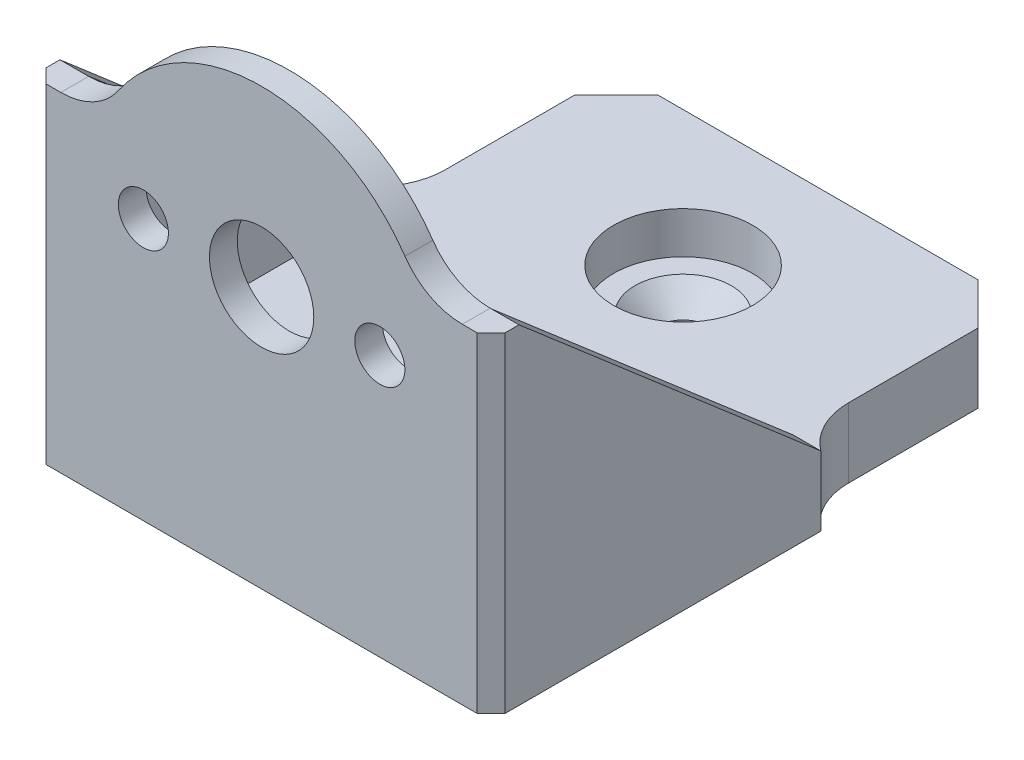
ISO-10303-21;
HEADER;
FILE_DESCRIPTION(('STEP AP214'),'2;1');
FILE_NAME('part.step','',(''),(''),'','','');
FILE_SCHEMA(('AUTOMOTIVE_DESIGN { 1 0 10303 214 1 1 1 1 }'));
ENDSEC;
DATA;
#1=APPLICATION_CONTEXT('core data for automotive mechanical design processes');
#2=APPLICATION_PROTOCOL_DEFINITION('international standard','automotive_design',2000,#1);
#3=PRODUCT_CONTEXT('',#1,'mechanical');
#4=PRODUCT('Part','Part','',(#3));
#5=PRODUCT_RELATED_PRODUCT_CATEGORY('part','',(#4));
#6=PRODUCT_DEFINITION_FORMATION('','',#4);
#7=PRODUCT_DEFINITION_CONTEXT('part definition',#1,'design');
#8=PRODUCT_DEFINITION('design','',#6,#7);
#9=PRODUCT_DEFINITION_SHAPE('','',#8);
#10=(LENGTH_UNIT() NAMED_UNIT(*) SI_UNIT(.MILLI.,.METRE.));
#11=(NAMED_UNIT(*) PLANE_ANGLE_UNIT() SI_UNIT($,.RADIAN.));
#12=(NAMED_UNIT(*) SI_UNIT($,.STERADIAN.) SOLID_ANGLE_UNIT());
#13=UNCERTAINTY_MEASURE_WITH_UNIT(LENGTH_MEASURE(1.E-05),#10,'distance_accuracy_value','');
#14=(GEOMETRIC_REPRESENTATION_CONTEXT(3) GLOBAL_UNCERTAINTY_ASSIGNED_CONTEXT((#13)) GLOBAL_UNIT_ASSIGNED_CONTEXT((#10,
#11,#12)) REPRESENTATION_CONTEXT('',''));
#15=CARTESIAN_POINT('',(0.,0.,0.));
#16=DIRECTION('',(0.,0.,1.));
#17=DIRECTION('',(1.,0.,0.));
#18=AXIS2_PLACEMENT_3D('',#15,#16,#17);
#19=CARTESIAN_POINT('',(0.,5.,0.));
#20=DIRECTION('',(0.,1.,0.));
#21=DIRECTION('',(0.,0.,1.));
#22=AXIS2_PLACEMENT_3D('',#19,#20,#21);
#23=PLANE('',#22);
#24=CARTESIAN_POINT('',(0.,5.,0.));
#25=DIRECTION('',(0.,1.,0.));
#26=DIRECTION('',(0.,0.,1.));
#27=AXIS2_PLACEMENT_3D('',#24,#25,#26);
#28=CIRCLE('',#27,5.);
#29=CARTESIAN_POINT('',(0.,5.,5.));
#30=VERTEX_POINT('',#29);
#31=EDGE_CURVE('E812',#30,#30,#28,.T.);
#32=ORIENTED_EDGE('',*,*,#31,.F.);
#33=EDGE_LOOP('',(#32));
#34=FACE_BOUND('',#33,.T.);
#35=CARTESIAN_POINT('',(0.,5.,20.));
#36=DIRECTION('',(0.,1.,0.));
#37=DIRECTION('',(0.,0.,1.));
#38=AXIS2_PLACEMENT_3D('',#35,#36,#37);
#39=CIRCLE('',#38,5.);
#40=CARTESIAN_POINT('',(0.,5.,25.));
#41=VERTEX_POINT('',#40);
#42=EDGE_CURVE('E809',#41,#41,#39,.T.);
#43=ORIENTED_EDGE('',*,*,#42,.F.);
#44=EDGE_LOOP('',(#43));
#45=FACE_BOUND('',#44,.T.);
#46=DIRECTION('',(0.,0.,-1.));
#47=VECTOR('',#46,1.);
#48=CARTESIAN_POINT('',(14.5,5.,-9.7));
#49=LINE('',#48,#47);
#50=CARTESIAN_POINT('',(14.5,5.,28.3));
#51=VERTEX_POINT('',#50);
#52=CARTESIAN_POINT('',(14.5,5.,6.60102051443365));
#53=VERTEX_POINT('',#52);
#54=EDGE_CURVE('E224',#51,#53,#49,.T.);
#55=ORIENTED_EDGE('',*,*,#54,.T.);
#56=DIRECTION('',(1.,0.,0.));
#57=VECTOR('',#56,1.);
#58=CARTESIAN_POINT('',(0.,5.,6.60102051443364));
#59=LINE('',#58,#57);
#60=CARTESIAN_POINT('',(16.5,5.,6.60102051443365));
#61=VERTEX_POINT('',#60);
#62=EDGE_CURVE('E11',#53,#61,#59,.T.);
#63=ORIENTED_EDGE('',*,*,#62,.T.);
#64=CARTESIAN_POINT('',(19.5,5.,2.60102051443364));
#65=DIRECTION('',(0.,1.,0.));
#66=DIRECTION('',(0.,0.,1.));
#67=AXIS2_PLACEMENT_3D('',#64,#65,#66);
#68=CIRCLE('',#67,5.);
#69=CARTESIAN_POINT('',(14.5,5.,2.60102051443364));
#70=VERTEX_POINT('',#69);
#71=EDGE_CURVE('E343',#61,#70,#68,.F.);
#72=ORIENTED_EDGE('',*,*,#71,.T.);
#73=CARTESIAN_POINT('',(14.5,5.,-6.69999999999997));
#74=VERTEX_POINT('',#73);
#75=EDGE_CURVE('E223',#70,#74,#49,.T.);
#76=ORIENTED_EDGE('',*,*,#75,.T.);
#77=DIRECTION('',(-0.707106781186546,0.,-0.707106781186549));
#78=VECTOR('',#77,1.);
#79=CARTESIAN_POINT('',(10.6,5.,-10.6));
#80=LINE('',#79,#78);
#81=CARTESIAN_POINT('',(11.5,5.,-9.7));
#82=VERTEX_POINT('',#81);
#83=EDGE_CURVE('E301',#74,#82,#80,.T.);
#84=ORIENTED_EDGE('',*,*,#83,.T.);
#85=DIRECTION('',(-1.,0.,0.));
#86=VECTOR('',#85,1.);
#87=CARTESIAN_POINT('',(-11.5,5.,-9.7));
#88=LINE('',#87,#86);
#89=CARTESIAN_POINT('',(-11.5,5.,-9.7));
#90=VERTEX_POINT('',#89);
#91=EDGE_CURVE('E268',#82,#90,#88,.T.);
#92=ORIENTED_EDGE('',*,*,#91,.T.);
#93=DIRECTION('',(-0.707106781186548,0.,0.707106781186547));
#94=VECTOR('',#93,1.);
#95=CARTESIAN_POINT('',(-10.6,5.,-10.6));
#96=LINE('',#95,#94);
#97=CARTESIAN_POINT('',(-14.5,5.,-6.7));
#98=VERTEX_POINT('',#97);
#99=EDGE_CURVE('E298',#90,#98,#96,.T.);
#100=ORIENTED_EDGE('',*,*,#99,.T.);
#101=DIRECTION('',(0.,0.,-1.));
#102=VECTOR('',#101,1.);
#103=CARTESIAN_POINT('',(-14.5,5.,28.3));
#104=LINE('',#103,#102);
#105=CARTESIAN_POINT('',(-14.5,5.,2.60102051443364));
#106=VERTEX_POINT('',#105);
#107=EDGE_CURVE('E241',#106,#98,#104,.T.);
#108=ORIENTED_EDGE('',*,*,#107,.F.);
#109=CARTESIAN_POINT('',(-19.5,5.,2.60102051443364));
#110=DIRECTION('',(0.,1.,0.));
#111=DIRECTION('',(0.,0.,1.));
#112=AXIS2_PLACEMENT_3D('',#109,#110,#111);
#113=CIRCLE('',#112,5.);
#114=CARTESIAN_POINT('',(-16.5,5.,6.60102051443364));
#115=VERTEX_POINT('',#114);
#116=EDGE_CURVE('E177',#106,#115,#113,.F.);
#117=ORIENTED_EDGE('',*,*,#116,.T.);
#118=DIRECTION('',(-1.,0.,0.));
#119=VECTOR('',#118,1.);
#120=CARTESIAN_POINT('',(-16.5,5.,6.60102051443364));
#121=LINE('',#120,#119);
#122=CARTESIAN_POINT('',(-14.5,5.,6.60102051443364));
#123=VERTEX_POINT('',#122);
#124=EDGE_CURVE('E44',#123,#115,#121,.T.);
#125=ORIENTED_EDGE('',*,*,#124,.F.);
#126=CARTESIAN_POINT('',(-14.5,5.,28.3));
#127=VERTEX_POINT('',#126);
#128=EDGE_CURVE('E242',#127,#123,#104,.T.);
#129=ORIENTED_EDGE('',*,*,#128,.F.);
#130=DIRECTION('',(-1.,0.,0.));
#131=VECTOR('',#130,1.);
#132=CARTESIAN_POINT('',(-11.5,5.,28.3));
#133=LINE('',#132,#131);
#134=EDGE_CURVE('E264',#51,#127,#133,.T.);
#135=ORIENTED_EDGE('',*,*,#134,.F.);
#136=EDGE_LOOP('',(#55,#63,#72,#76,#84,#92,#100,#108,#117,#125,#129,#135));
#137=FACE_BOUND('',#136,.T.);
#138=ADVANCED_FACE('F35',(#34,#45,#137),#23,.T.);
#139=CARTESIAN_POINT('',(0.,0.,0.));
#140=DIRECTION('',(0.,1.,0.));
#141=DIRECTION('',(0.,0.,1.));
#142=AXIS2_PLACEMENT_3D('',#139,#140,#141);
#143=PLANE('',#142);
#144=CARTESIAN_POINT('',(0.,0.,0.));
#145=DIRECTION('',(0.,1.,0.));
#146=DIRECTION('',(0.,0.,1.));
#147=AXIS2_PLACEMENT_3D('',#144,#145,#146);
#148=CIRCLE('',#147,1.8);
#149=CARTESIAN_POINT('',(0.,0.,1.8));
#150=VERTEX_POINT('',#149);
#151=EDGE_CURVE('E795',#150,#150,#148,.T.);
#152=ORIENTED_EDGE('',*,*,#151,.T.);
#153=EDGE_LOOP('',(#152));
#154=FACE_BOUND('',#153,.T.);
#155=CARTESIAN_POINT('',(0.,0.,20.));
#156=DIRECTION('',(0.,1.,0.));
#157=DIRECTION('',(0.,0.,1.));
#158=AXIS2_PLACEMENT_3D('',#155,#156,#157);
#159=CIRCLE('',#158,1.8);
#160=CARTESIAN_POINT('',(0.,0.,21.8));
#161=VERTEX_POINT('',#160);
#162=EDGE_CURVE('E806',#161,#161,#159,.T.);
#163=ORIENTED_EDGE('',*,*,#162,.T.);
#164=EDGE_LOOP('',(#163));
#165=FACE_BOUND('',#164,.T.);
#166=DIRECTION('',(0.,0.,-1.));
#167=VECTOR('',#166,1.);
#168=CARTESIAN_POINT('',(16.5,0.,30.3));
#169=LINE('',#168,#167);
#170=CARTESIAN_POINT('',(16.5,0.,29.3));
#171=VERTEX_POINT('',#170);
#172=CARTESIAN_POINT('',(16.5,0.,6.60102051443365));
#173=VERTEX_POINT('',#172);
#174=EDGE_CURVE('E207',#171,#173,#169,.T.);
#175=ORIENTED_EDGE('',*,*,#174,.F.);
#176=DIRECTION('',(-0.707106781186551,0.,0.707106781186544));
#177=VECTOR('',#176,1.);
#178=CARTESIAN_POINT('',(16.5,0.,29.3));
#179=LINE('',#178,#177);
#180=CARTESIAN_POINT('',(15.5,0.,30.3));
#181=VERTEX_POINT('',#180);
#182=EDGE_CURVE('E310',#171,#181,#179,.T.);
#183=ORIENTED_EDGE('',*,*,#182,.T.);
#184=DIRECTION('',(1.,0.,0.));
#185=VECTOR('',#184,1.);
#186=CARTESIAN_POINT('',(-11.5,0.,30.3));
#187=LINE('',#186,#185);
#188=CARTESIAN_POINT('',(-15.5,0.,30.3));
#189=VERTEX_POINT('',#188);
#190=EDGE_CURVE('E266',#189,#181,#187,.T.);
#191=ORIENTED_EDGE('',*,*,#190,.F.);
#192=DIRECTION('',(-0.70710678118655,0.,-0.707106781186545));
#193=VECTOR('',#192,1.);
#194=CARTESIAN_POINT('',(-16.5,0.,29.3));
#195=LINE('',#194,#193);
#196=CARTESIAN_POINT('',(-16.5,0.,29.3));
#197=VERTEX_POINT('',#196);
#198=EDGE_CURVE('E190',#189,#197,#195,.T.);
#199=ORIENTED_EDGE('',*,*,#198,.T.);
#200=DIRECTION('',(0.,0.,1.));
#201=VECTOR('',#200,1.);
#202=CARTESIAN_POINT('',(-16.5,0.,0.));
#203=LINE('',#202,#201);
#204=CARTESIAN_POINT('',(-16.5,0.,6.60102051443364));
#205=VERTEX_POINT('',#204);
#206=EDGE_CURVE('E183',#205,#197,#203,.T.);
#207=ORIENTED_EDGE('',*,*,#206,.F.);
#208=CARTESIAN_POINT('',(-19.5,0.,2.60102051443364));
#209=DIRECTION('',(0.,1.,0.));
#210=DIRECTION('',(0.,0.,1.));
#211=AXIS2_PLACEMENT_3D('',#208,#209,#210);
#212=CIRCLE('',#211,5.);
#213=CARTESIAN_POINT('',(-14.5,0.,2.60102051443364));
#214=VERTEX_POINT('',#213);
#215=EDGE_CURVE('E168',#205,#214,#212,.T.);
#216=ORIENTED_EDGE('',*,*,#215,.T.);
#217=DIRECTION('',(0.,0.,1.));
#218=VECTOR('',#217,1.);
#219=CARTESIAN_POINT('',(-14.5,0.,-9.7));
#220=LINE('',#219,#218);
#221=CARTESIAN_POINT('',(-14.5,0.,-6.7));
#222=VERTEX_POINT('',#221);
#223=EDGE_CURVE('E234',#222,#214,#220,.T.);
#224=ORIENTED_EDGE('',*,*,#223,.F.);
#225=DIRECTION('',(0.707106781186548,0.,-0.707106781186547));
#226=VECTOR('',#225,1.);
#227=CARTESIAN_POINT('',(-14.5,0.,-6.7));
#228=LINE('',#227,#226);
#229=CARTESIAN_POINT('',(-11.5,0.,-9.7));
#230=VERTEX_POINT('',#229);
#231=EDGE_CURVE('E291',#222,#230,#228,.T.);
#232=ORIENTED_EDGE('',*,*,#231,.T.);
#233=DIRECTION('',(-1.,0.,0.));
#234=VECTOR('',#233,1.);
#235=CARTESIAN_POINT('',(-11.5,0.,-9.7));
#236=LINE('',#235,#234);
#237=CARTESIAN_POINT('',(11.5,0.,-9.7));
#238=VERTEX_POINT('',#237);
#239=EDGE_CURVE('E272',#238,#230,#236,.T.);
#240=ORIENTED_EDGE('',*,*,#239,.F.);
#241=DIRECTION('',(0.707106781186546,0.,0.707106781186549));
#242=VECTOR('',#241,1.);
#243=CARTESIAN_POINT('',(11.5,0.,-9.7));
#244=LINE('',#243,#242);
#245=CARTESIAN_POINT('',(14.5,0.,-6.69999999999997));
#246=VERTEX_POINT('',#245);
#247=EDGE_CURVE('E293',#238,#246,#244,.T.);
#248=ORIENTED_EDGE('',*,*,#247,.T.);
#249=DIRECTION('',(0.,0.,1.));
#250=VECTOR('',#249,1.);
#251=CARTESIAN_POINT('',(14.5,0.,-9.7));
#252=LINE('',#251,#250);
#253=CARTESIAN_POINT('',(14.5,0.,2.60102051443364));
#254=VERTEX_POINT('',#253);
#255=EDGE_CURVE('E227',#246,#254,#252,.T.);
#256=ORIENTED_EDGE('',*,*,#255,.T.);
#257=CARTESIAN_POINT('',(19.5,0.,2.60102051443364));
#258=DIRECTION('',(0.,1.,0.));
#259=DIRECTION('',(0.,0.,1.));
#260=AXIS2_PLACEMENT_3D('',#257,#258,#259);
#261=CIRCLE('',#260,5.);
#262=EDGE_CURVE('E345',#254,#173,#261,.T.);
#263=ORIENTED_EDGE('',*,*,#262,.T.);
#264=EDGE_LOOP('',(#175,#183,#191,#199,#207,#216,#224,#232,#240,#248,#256,#263));
#265=FACE_BOUND('',#264,.T.);
#266=ADVANCED_FACE('F187',(#154,#165,#265),#143,.F.);
#267=CARTESIAN_POINT('',(-11.5,5.,30.3));
#268=DIRECTION('',(0.,0.,-1.));
#269=DIRECTION('',(-1.,0.,0.));
#270=AXIS2_PLACEMENT_3D('',#267,#268,#269);
#271=PLANE('',#270);
#272=CARTESIAN_POINT('',(0.,18.8,30.3));
#273=DIRECTION('',(0.,0.,1.));
#274=DIRECTION('',(1.,0.,0.));
#275=AXIS2_PLACEMENT_3D('',#272,#273,#274);
#276=CIRCLE('',#275,3.75);
#277=CARTESIAN_POINT('',(3.75000000000001,18.8,30.3));
#278=VERTEX_POINT('',#277);
#279=EDGE_CURVE('E256',#278,#278,#276,.T.);
#280=ORIENTED_EDGE('',*,*,#279,.F.);
#281=EDGE_LOOP('',(#280));
#282=FACE_BOUND('',#281,.T.);
#283=CARTESIAN_POINT('',(8.50000000000001,18.8,30.3));
#284=DIRECTION('',(0.,0.,1.));
#285=DIRECTION('',(1.,0.,0.));
#286=AXIS2_PLACEMENT_3D('',#283,#284,#285);
#287=CIRCLE('',#286,1.8);
#288=CARTESIAN_POINT('',(10.3,18.8,30.3));
#289=VERTEX_POINT('',#288);
#290=EDGE_CURVE('E252',#289,#289,#287,.T.);
#291=ORIENTED_EDGE('',*,*,#290,.F.);
#292=EDGE_LOOP('',(#291));
#293=FACE_BOUND('',#292,.T.);
#294=CARTESIAN_POINT('',(-8.49999999999999,18.8,30.3));
#295=DIRECTION('',(0.,0.,1.));
#296=DIRECTION('',(1.,0.,0.));
#297=AXIS2_PLACEMENT_3D('',#294,#295,#296);
#298=CIRCLE('',#297,1.8);
#299=CARTESIAN_POINT('',(-6.7,18.8,30.3));
#300=VERTEX_POINT('',#299);
#301=EDGE_CURVE('E255',#300,#300,#298,.T.);
#302=ORIENTED_EDGE('',*,*,#301,.F.);
#303=EDGE_LOOP('',(#302));
#304=FACE_BOUND('',#303,.T.);
#305=ORIENTED_EDGE('',*,*,#190,.T.);
#306=DIRECTION('',(0.,1.,0.));
#307=VECTOR('',#306,1.);
#308=CARTESIAN_POINT('',(15.5,23.6989794855664,30.3));
#309=LINE('',#308,#307);
#310=CARTESIAN_POINT('',(15.5,23.6989794855664,30.3));
#311=VERTEX_POINT('',#310);
#312=EDGE_CURVE('E314',#181,#311,#309,.T.);
#313=ORIENTED_EDGE('',*,*,#312,.T.);
#314=DIRECTION('',(-1.,0.,0.));
#315=VECTOR('',#314,1.);
#316=CARTESIAN_POINT('',(14.5,23.6989794855664,30.3));
#317=LINE('',#316,#315);
#318=CARTESIAN_POINT('',(14.4312232726244,23.6989794855664,30.3));
#319=VERTEX_POINT('',#318);
#320=EDGE_CURVE('E230',#311,#319,#317,.T.);
#321=ORIENTED_EDGE('',*,*,#320,.T.);
#322=CARTESIAN_POINT('',(14.4312232726244,28.6989794855664,30.3));
#323=DIRECTION('',(0.,0.,-1.));
#324=DIRECTION('',(-1.,0.,0.));
#325=AXIS2_PLACEMENT_3D('',#322,#323,#324);
#326=CIRCLE('',#325,5.);
#327=CARTESIAN_POINT('',(10.3080166233032,25.8706996325474,30.3));
#328=VERTEX_POINT('',#327);
#329=EDGE_CURVE('E335',#319,#328,#326,.T.);
#330=ORIENTED_EDGE('',*,*,#329,.T.);
#331=CARTESIAN_POINT('',(0.,18.8,30.3));
#332=DIRECTION('',(0.,0.,-1.));
#333=DIRECTION('',(1.,0.,0.));
#334=AXIS2_PLACEMENT_3D('',#331,#332,#333);
#335=CIRCLE('',#334,12.5);
#336=CARTESIAN_POINT('',(-10.3080166233031,25.8706996325474,30.3));
#337=VERTEX_POINT('',#336);
#338=EDGE_CURVE('E251',#337,#328,#335,.T.);
#339=ORIENTED_EDGE('',*,*,#338,.F.);
#340=CARTESIAN_POINT('',(-14.4312232726244,28.6989794855664,30.3));
#341=DIRECTION('',(0.,0.,-1.));
#342=DIRECTION('',(-1.,0.,0.));
#343=AXIS2_PLACEMENT_3D('',#340,#341,#342);
#344=CIRCLE('',#343,5.);
#345=CARTESIAN_POINT('',(-14.4312232726244,23.6989794855664,30.3));
#346=VERTEX_POINT('',#345);
#347=EDGE_CURVE('E339',#337,#346,#344,.T.);
#348=ORIENTED_EDGE('',*,*,#347,.T.);
#349=DIRECTION('',(1.,0.,0.));
#350=VECTOR('',#349,1.);
#351=CARTESIAN_POINT('',(-14.5,23.6989794855664,30.3));
#352=LINE('',#351,#350);
#353=CARTESIAN_POINT('',(-15.5,23.6989794855664,30.3));
#354=VERTEX_POINT('',#353);
#355=EDGE_CURVE('E248',#354,#346,#352,.T.);
#356=ORIENTED_EDGE('',*,*,#355,.F.);
#357=DIRECTION('',(0.,-1.,0.));
#358=VECTOR('',#357,1.);
#359=CARTESIAN_POINT('',(-15.5,0.,30.3));
#360=LINE('',#359,#358);
#361=EDGE_CURVE('E312',#354,#189,#360,.T.);
#362=ORIENTED_EDGE('',*,*,#361,.T.);
#363=EDGE_LOOP('',(#305,#313,#321,#330,#339,#348,#356,#362));
#364=FACE_BOUND('',#363,.T.);
#365=ADVANCED_FACE('F432',(#282,#293,#304,#364),#271,.F.);
#366=CARTESIAN_POINT('',(-11.5,5.,-9.7));
#367=DIRECTION('',(0.,0.,1.));
#368=DIRECTION('',(1.,0.,0.));
#369=AXIS2_PLACEMENT_3D('',#366,#367,#368);
#370=PLANE('',#369);
#371=ORIENTED_EDGE('',*,*,#91,.F.);
#372=DIRECTION('',(0.,-1.,0.));
#373=VECTOR('',#372,1.);
#374=CARTESIAN_POINT('',(11.5,0.,-9.7));
#375=LINE('',#374,#373);
#376=EDGE_CURVE('E288',#82,#238,#375,.T.);
#377=ORIENTED_EDGE('',*,*,#376,.T.);
#378=ORIENTED_EDGE('',*,*,#239,.T.);
#379=DIRECTION('',(0.,1.,0.));
#380=VECTOR('',#379,1.);
#381=CARTESIAN_POINT('',(-11.5,5.,-9.7));
#382=LINE('',#381,#380);
#383=EDGE_CURVE('E286',#230,#90,#382,.T.);
#384=ORIENTED_EDGE('',*,*,#383,.T.);
#385=EDGE_LOOP('',(#371,#377,#378,#384));
#386=FACE_BOUND('',#385,.T.);
#387=ADVANCED_FACE('F409',(#386),#370,.F.);
#388=CARTESIAN_POINT('',(-11.5,55.,28.3));
#389=DIRECTION('',(0.,0.,1.));
#390=DIRECTION('',(1.,0.,0.));
#391=AXIS2_PLACEMENT_3D('',#388,#389,#390);
#392=PLANE('',#391);
#393=CARTESIAN_POINT('',(0.,18.8,28.3));
#394=DIRECTION('',(0.,0.,1.));
#395=DIRECTION('',(1.,0.,0.));
#396=AXIS2_PLACEMENT_3D('',#393,#394,#395);
#397=CIRCLE('',#396,3.75);
#398=CARTESIAN_POINT('',(3.75000000000001,18.8,28.3));
#399=VERTEX_POINT('',#398);
#400=EDGE_CURVE('E267',#399,#399,#397,.T.);
#401=ORIENTED_EDGE('',*,*,#400,.T.);
#402=EDGE_LOOP('',(#401));
#403=FACE_BOUND('',#402,.T.);
#404=CARTESIAN_POINT('',(8.50000000000001,18.8,28.3));
#405=DIRECTION('',(0.,0.,1.));
#406=DIRECTION('',(1.,0.,0.));
#407=AXIS2_PLACEMENT_3D('',#404,#405,#406);
#408=CIRCLE('',#407,1.8);
#409=CARTESIAN_POINT('',(10.3,18.8,28.3));
#410=VERTEX_POINT('',#409);
#411=EDGE_CURVE('E279',#410,#410,#408,.T.);
#412=ORIENTED_EDGE('',*,*,#411,.T.);
#413=EDGE_LOOP('',(#412));
#414=FACE_BOUND('',#413,.T.);
#415=CARTESIAN_POINT('',(-8.49999999999999,18.8,28.3));
#416=DIRECTION('',(0.,0.,1.));
#417=DIRECTION('',(1.,0.,0.));
#418=AXIS2_PLACEMENT_3D('',#415,#416,#417);
#419=CIRCLE('',#418,1.8);
#420=CARTESIAN_POINT('',(-6.7,18.8,28.3));
#421=VERTEX_POINT('',#420);
#422=EDGE_CURVE('E263',#421,#421,#419,.T.);
#423=ORIENTED_EDGE('',*,*,#422,.T.);
#424=EDGE_LOOP('',(#423));
#425=FACE_BOUND('',#424,.T.);
#426=ORIENTED_EDGE('',*,*,#134,.T.);
#427=DIRECTION('',(0.,-1.,0.));
#428=VECTOR('',#427,1.);
#429=CARTESIAN_POINT('',(-14.5,23.6989794855664,28.3));
#430=LINE('',#429,#428);
#431=CARTESIAN_POINT('',(-14.5,23.6989794855664,28.3));
#432=VERTEX_POINT('',#431);
#433=EDGE_CURVE('E238',#432,#127,#430,.T.);
#434=ORIENTED_EDGE('',*,*,#433,.F.);
#435=DIRECTION('',(1.,0.,0.));
#436=VECTOR('',#435,1.);
#437=CARTESIAN_POINT('',(-14.5,23.6989794855664,28.3));
#438=LINE('',#437,#436);
#439=CARTESIAN_POINT('',(-14.4312232726244,23.6989794855664,28.3));
#440=VERTEX_POINT('',#439);
#441=EDGE_CURVE('E245',#432,#440,#438,.T.);
#442=ORIENTED_EDGE('',*,*,#441,.T.);
#443=CARTESIAN_POINT('',(-14.4312232726244,28.6989794855664,28.3));
#444=DIRECTION('',(0.,0.,1.));
#445=DIRECTION('',(1.,0.,0.));
#446=AXIS2_PLACEMENT_3D('',#443,#444,#445);
#447=CIRCLE('',#446,5.);
#448=CARTESIAN_POINT('',(-10.3080166233031,25.8706996325474,28.3));
#449=VERTEX_POINT('',#448);
#450=EDGE_CURVE('E178',#440,#449,#447,.T.);
#451=ORIENTED_EDGE('',*,*,#450,.T.);
#452=CARTESIAN_POINT('',(0.,18.8,28.3));
#453=DIRECTION('',(0.,0.,1.));
#454=DIRECTION('',(1.,0.,0.));
#455=AXIS2_PLACEMENT_3D('',#452,#453,#454);
#456=CIRCLE('',#455,12.5);
#457=CARTESIAN_POINT('',(10.3080166233032,25.8706996325474,28.3));
#458=VERTEX_POINT('',#457);
#459=EDGE_CURVE('E271',#449,#458,#456,.F.);
#460=ORIENTED_EDGE('',*,*,#459,.T.);
#461=CARTESIAN_POINT('',(14.4312232726244,28.6989794855664,28.3));
#462=DIRECTION('',(0.,0.,1.));
#463=DIRECTION('',(1.,0.,0.));
#464=AXIS2_PLACEMENT_3D('',#461,#462,#463);
#465=CIRCLE('',#464,5.);
#466=CARTESIAN_POINT('',(14.4312232726244,23.6989794855664,28.3));
#467=VERTEX_POINT('',#466);
#468=EDGE_CURVE('E337',#458,#467,#465,.T.);
#469=ORIENTED_EDGE('',*,*,#468,.T.);
#470=DIRECTION('',(-1.,0.,0.));
#471=VECTOR('',#470,1.);
#472=CARTESIAN_POINT('',(14.5,23.6989794855664,28.3));
#473=LINE('',#472,#471);
#474=CARTESIAN_POINT('',(14.5,23.6989794855664,28.3));
#475=VERTEX_POINT('',#474);
#476=EDGE_CURVE('E231',#475,#467,#473,.T.);
#477=ORIENTED_EDGE('',*,*,#476,.F.);
#478=DIRECTION('',(0.,-1.,0.));
#479=VECTOR('',#478,1.);
#480=CARTESIAN_POINT('',(14.5,5.,28.3));
#481=LINE('',#480,#479);
#482=EDGE_CURVE('E220',#475,#51,#481,.T.);
#483=ORIENTED_EDGE('',*,*,#482,.T.);
#484=EDGE_LOOP('',(#426,#434,#442,#451,#460,#469,#477,#483));
#485=FACE_BOUND('',#484,.T.);
#486=ADVANCED_FACE('F357',(#403,#414,#425,#485),#392,.F.);
#487=CARTESIAN_POINT('',(-8.49999999999999,18.8,-9.7));
#488=DIRECTION('',(0.,0.,1.));
#489=DIRECTION('',(1.,0.,0.));
#490=AXIS2_PLACEMENT_3D('',#487,#488,#489);
#491=CYLINDRICAL_SURFACE('',#490,1.8);
#492=ORIENTED_EDGE('',*,*,#301,.T.);
#493=EDGE_LOOP('',(#492));
#494=FACE_BOUND('',#493,.T.);
#495=ORIENTED_EDGE('',*,*,#422,.F.);
#496=EDGE_LOOP('',(#495));
#497=FACE_BOUND('',#496,.T.);
#498=ADVANCED_FACE('F580',(#494,#497),#491,.F.);
#499=CARTESIAN_POINT('',(8.50000000000001,18.8,-9.7));
#500=DIRECTION('',(0.,0.,1.));
#501=DIRECTION('',(1.,0.,0.));
#502=AXIS2_PLACEMENT_3D('',#499,#500,#501);
#503=CYLINDRICAL_SURFACE('',#502,1.8);
#504=ORIENTED_EDGE('',*,*,#290,.T.);
#505=EDGE_LOOP('',(#504));
#506=FACE_BOUND('',#505,.T.);
#507=ORIENTED_EDGE('',*,*,#411,.F.);
#508=EDGE_LOOP('',(#507));
#509=FACE_BOUND('',#508,.T.);
#510=ADVANCED_FACE('F572',(#506,#509),#503,.F.);
#511=CARTESIAN_POINT('',(0.,18.8,-9.7));
#512=DIRECTION('',(0.,0.,1.));
#513=DIRECTION('',(1.,0.,0.));
#514=AXIS2_PLACEMENT_3D('',#511,#512,#513);
#515=CYLINDRICAL_SURFACE('',#514,3.75);
#516=ORIENTED_EDGE('',*,*,#279,.T.);
#517=EDGE_LOOP('',(#516));
#518=FACE_BOUND('',#517,.T.);
#519=ORIENTED_EDGE('',*,*,#400,.F.);
#520=EDGE_LOOP('',(#519));
#521=FACE_BOUND('',#520,.T.);
#522=ADVANCED_FACE('F561',(#518,#521),#515,.F.);
#523=CARTESIAN_POINT('',(0.,18.8,-9.7));
#524=DIRECTION('',(0.,0.,1.));
#525=DIRECTION('',(1.,0.,0.));
#526=AXIS2_PLACEMENT_3D('',#523,#524,#525);
#527=CYLINDRICAL_SURFACE('',#526,12.5);
#528=ORIENTED_EDGE('',*,*,#338,.T.);
#529=DIRECTION('',(0.,0.,1.));
#530=VECTOR('',#529,1.);
#531=CARTESIAN_POINT('',(10.3080166233032,25.8706996325474,-9.7));
#532=LINE('',#531,#530);
#533=EDGE_CURVE('E328',#328,#458,#532,.F.);
#534=ORIENTED_EDGE('',*,*,#533,.T.);
#535=ORIENTED_EDGE('',*,*,#459,.F.);
#536=DIRECTION('',(0.,0.,1.));
#537=VECTOR('',#536,1.);
#538=CARTESIAN_POINT('',(-10.3080166233031,25.8706996325474,-9.7));
#539=LINE('',#538,#537);
#540=EDGE_CURVE('E325',#449,#337,#539,.T.);
#541=ORIENTED_EDGE('',*,*,#540,.T.);
#542=EDGE_LOOP('',(#528,#534,#535,#541));
#543=FACE_BOUND('',#542,.T.);
#544=ADVANCED_FACE('F371',(#543),#527,.T.);
#545=CARTESIAN_POINT('',(-14.5,23.6989794855664,30.3));
#546=DIRECTION('',(0.,-1.,0.));
#547=DIRECTION('',(0.,0.,-1.));
#548=AXIS2_PLACEMENT_3D('',#545,#546,#547);
#549=PLANE('',#548);
#550=ORIENTED_EDGE('',*,*,#355,.T.);
#551=DIRECTION('',(0.,0.,-1.));
#552=VECTOR('',#551,1.);
#553=CARTESIAN_POINT('',(-14.4312232726244,23.6989794855664,28.3));
#554=LINE('',#553,#552);
#555=EDGE_CURVE('E330',#346,#440,#554,.T.);
#556=ORIENTED_EDGE('',*,*,#555,.T.);
#557=ORIENTED_EDGE('',*,*,#441,.F.);
#558=DIRECTION('',(1.,0.,0.));
#559=VECTOR('',#558,1.);
#560=CARTESIAN_POINT('',(-16.5,23.6989794855664,28.3));
#561=LINE('',#560,#559);
#562=CARTESIAN_POINT('',(-16.5,23.6989794855664,28.3));
#563=VERTEX_POINT('',#562);
#564=EDGE_CURVE('E193',#563,#432,#561,.T.);
#565=ORIENTED_EDGE('',*,*,#564,.F.);
#566=DIRECTION('',(0.,0.,-1.));
#567=VECTOR('',#566,1.);
#568=CARTESIAN_POINT('',(-16.5,23.6989794855664,0.));
#569=LINE('',#568,#567);
#570=CARTESIAN_POINT('',(-16.5,23.6989794855664,29.3));
#571=VERTEX_POINT('',#570);
#572=EDGE_CURVE('E191',#571,#563,#569,.T.);
#573=ORIENTED_EDGE('',*,*,#572,.F.);
#574=DIRECTION('',(0.70710678118655,0.,0.707106781186545));
#575=VECTOR('',#574,1.);
#576=CARTESIAN_POINT('',(-16.5,23.6989794855664,29.3));
#577=LINE('',#576,#575);
#578=EDGE_CURVE('E320',#571,#354,#577,.T.);
#579=ORIENTED_EDGE('',*,*,#578,.T.);
#580=EDGE_LOOP('',(#550,#556,#557,#565,#573,#579));
#581=FACE_BOUND('',#580,.T.);
#582=ADVANCED_FACE('F362',(#581),#549,.F.);
#583=CARTESIAN_POINT('',(-14.5,0.,0.));
#584=DIRECTION('',(-1.,0.,0.));
#585=DIRECTION('',(0.,0.,1.));
#586=AXIS2_PLACEMENT_3D('',#583,#584,#585);
#587=PLANE('',#586);
#588=ORIENTED_EDGE('',*,*,#223,.T.);
#589=DIRECTION('',(0.,1.,0.));
#590=VECTOR('',#589,1.);
#591=CARTESIAN_POINT('',(-14.5,5.,2.60102051443364));
#592=LINE('',#591,#590);
#593=EDGE_CURVE('E172',#214,#106,#592,.T.);
#594=ORIENTED_EDGE('',*,*,#593,.T.);
#595=ORIENTED_EDGE('',*,*,#107,.T.);
#596=DIRECTION('',(0.,-1.,0.));
#597=VECTOR('',#596,1.);
#598=CARTESIAN_POINT('',(-14.5,0.,-6.7));
#599=LINE('',#598,#597);
#600=EDGE_CURVE('E303',#98,#222,#599,.T.);
#601=ORIENTED_EDGE('',*,*,#600,.T.);
#602=EDGE_LOOP('',(#588,#594,#595,#601));
#603=FACE_BOUND('',#602,.T.);
#604=ADVANCED_FACE('F416',(#603),#587,.T.);
#605=CARTESIAN_POINT('',(14.5,23.6989794855664,-9.7));
#606=DIRECTION('',(0.,1.,0.));
#607=DIRECTION('',(0.,0.,1.));
#608=AXIS2_PLACEMENT_3D('',#605,#606,#607);
#609=PLANE('',#608);
#610=ORIENTED_EDGE('',*,*,#476,.T.);
#611=DIRECTION('',(0.,0.,1.));
#612=VECTOR('',#611,1.);
#613=CARTESIAN_POINT('',(14.4312232726244,23.6989794855664,-9.7));
#614=LINE('',#613,#612);
#615=EDGE_CURVE('E322',#467,#319,#614,.T.);
#616=ORIENTED_EDGE('',*,*,#615,.T.);
#617=ORIENTED_EDGE('',*,*,#320,.F.);
#618=DIRECTION('',(0.707106781186551,0.,-0.707106781186544));
#619=VECTOR('',#618,1.);
#620=CARTESIAN_POINT('',(35.,23.6989794855664,10.8000000000002));
#621=LINE('',#620,#619);
#622=CARTESIAN_POINT('',(16.5,23.6989794855664,29.3));
#623=VERTEX_POINT('',#622);
#624=EDGE_CURVE('E316',#311,#623,#621,.T.);
#625=ORIENTED_EDGE('',*,*,#624,.T.);
#626=DIRECTION('',(0.,0.,1.));
#627=VECTOR('',#626,1.);
#628=CARTESIAN_POINT('',(16.5,23.6989794855664,28.3));
#629=LINE('',#628,#627);
#630=CARTESIAN_POINT('',(16.5,23.6989794855664,28.3));
#631=VERTEX_POINT('',#630);
#632=EDGE_CURVE('E204',#631,#623,#629,.T.);
#633=ORIENTED_EDGE('',*,*,#632,.F.);
#634=DIRECTION('',(-1.,0.,0.));
#635=VECTOR('',#634,1.);
#636=CARTESIAN_POINT('',(16.5,23.6989794855664,28.3));
#637=LINE('',#636,#635);
#638=EDGE_CURVE('E215',#631,#475,#637,.T.);
#639=ORIENTED_EDGE('',*,*,#638,.T.);
#640=EDGE_LOOP('',(#610,#616,#617,#625,#633,#639));
#641=FACE_BOUND('',#640,.T.);
#642=ADVANCED_FACE('F379',(#641),#609,.T.);
#643=CARTESIAN_POINT('',(14.5,0.,0.));
#644=DIRECTION('',(1.,0.,0.));
#645=DIRECTION('',(0.,0.,-1.));
#646=AXIS2_PLACEMENT_3D('',#643,#644,#645);
#647=PLANE('',#646);
#648=ORIENTED_EDGE('',*,*,#75,.F.);
#649=DIRECTION('',(0.,-1.,0.));
#650=VECTOR('',#649,1.);
#651=CARTESIAN_POINT('',(14.5,0.,2.60102051443364));
#652=LINE('',#651,#650);
#653=EDGE_CURVE('E333',#70,#254,#652,.T.);
#654=ORIENTED_EDGE('',*,*,#653,.T.);
#655=ORIENTED_EDGE('',*,*,#255,.F.);
#656=DIRECTION('',(0.,1.,0.));
#657=VECTOR('',#656,1.);
#658=CARTESIAN_POINT('',(14.5,5.,-6.69999999999997));
#659=LINE('',#658,#657);
#660=EDGE_CURVE('E295',#246,#74,#659,.T.);
#661=ORIENTED_EDGE('',*,*,#660,.T.);
#662=EDGE_LOOP('',(#648,#654,#655,#661));
#663=FACE_BOUND('',#662,.T.);
#664=ADVANCED_FACE('F400',(#663),#647,.T.);
#665=CARTESIAN_POINT('',(16.5,5.,6.60102051443365));
#666=DIRECTION('',(0.,-0.757531447352422,0.652798672082094));
#667=DIRECTION('',(0.,-0.652798672082094,-0.757531447352422));
#668=AXIS2_PLACEMENT_3D('',#665,#666,#667);
#669=PLANE('',#668);
#670=DIRECTION('',(0.,0.652798672082094,0.757531447352421));
#671=VECTOR('',#670,1.);
#672=CARTESIAN_POINT('',(14.5,5.,6.60102051443365));
#673=LINE('',#672,#671);
#674=EDGE_CURVE('E203',#53,#475,#673,.T.);
#675=ORIENTED_EDGE('',*,*,#674,.T.);
#676=ORIENTED_EDGE('',*,*,#638,.F.);
#677=DIRECTION('',(0.,0.652798672082094,0.757531447352421));
#678=VECTOR('',#677,1.);
#679=CARTESIAN_POINT('',(16.5,5.,6.60102051443365));
#680=LINE('',#679,#678);
#681=EDGE_CURVE('E213',#61,#631,#680,.T.);
#682=ORIENTED_EDGE('',*,*,#681,.F.);
#683=ORIENTED_EDGE('',*,*,#62,.F.);
#684=EDGE_LOOP('',(#675,#676,#682,#683));
#685=FACE_BOUND('',#684,.T.);
#686=ADVANCED_FACE('F385',(#685),#669,.F.);
#687=CARTESIAN_POINT('',(16.5,0.,0.));
#688=DIRECTION('',(1.,0.,0.));
#689=DIRECTION('',(0.,0.,-1.));
#690=AXIS2_PLACEMENT_3D('',#687,#688,#689);
#691=PLANE('',#690);
#692=ORIENTED_EDGE('',*,*,#632,.T.);
#693=DIRECTION('',(0.,-1.,0.));
#694=VECTOR('',#693,1.);
#695=CARTESIAN_POINT('',(16.5,0.,29.3));
#696=LINE('',#695,#694);
#697=EDGE_CURVE('E306',#623,#171,#696,.T.);
#698=ORIENTED_EDGE('',*,*,#697,.T.);
#699=ORIENTED_EDGE('',*,*,#174,.T.);
#700=DIRECTION('',(0.,1.,0.));
#701=VECTOR('',#700,1.);
#702=CARTESIAN_POINT('',(16.5,0.,6.60102051443365));
#703=LINE('',#702,#701);
#704=EDGE_CURVE('E210',#173,#61,#703,.T.);
#705=ORIENTED_EDGE('',*,*,#704,.T.);
#706=ORIENTED_EDGE('',*,*,#681,.T.);
#707=EDGE_LOOP('',(#692,#698,#699,#705,#706));
#708=FACE_BOUND('',#707,.T.);
#709=ADVANCED_FACE('F394',(#708),#691,.T.);
#710=CARTESIAN_POINT('',(14.5,0.,0.));
#711=DIRECTION('',(1.,0.,0.));
#712=DIRECTION('',(0.,0.,-1.));
#713=AXIS2_PLACEMENT_3D('',#710,#711,#712);
#714=PLANE('',#713);
#715=ORIENTED_EDGE('',*,*,#482,.F.);
#716=ORIENTED_EDGE('',*,*,#674,.F.);
#717=ORIENTED_EDGE('',*,*,#54,.F.);
#718=EDGE_LOOP('',(#715,#716,#717));
#719=FACE_BOUND('',#718,.T.);
#720=ADVANCED_FACE('F389',(#719),#714,.F.);
#721=CARTESIAN_POINT('',(-14.5,0.,0.));
#722=DIRECTION('',(-1.,0.,0.));
#723=DIRECTION('',(0.,0.,1.));
#724=AXIS2_PLACEMENT_3D('',#721,#722,#723);
#725=PLANE('',#724);
#726=DIRECTION('',(0.,-0.652798672082094,-0.757531447352422));
#727=VECTOR('',#726,1.);
#728=CARTESIAN_POINT('',(-14.5,-0.395037642677276,0.340421575188014));
#729=LINE('',#728,#727);
#730=EDGE_CURVE('E197',#432,#123,#729,.T.);
#731=ORIENTED_EDGE('',*,*,#730,.F.);
#732=ORIENTED_EDGE('',*,*,#433,.T.);
#733=ORIENTED_EDGE('',*,*,#128,.T.);
#734=EDGE_LOOP('',(#731,#732,#733));
#735=FACE_BOUND('',#734,.T.);
#736=ADVANCED_FACE('F354',(#735),#725,.F.);
#737=CARTESIAN_POINT('',(-16.5,-0.395037642677276,0.340421575188014));
#738=DIRECTION('',(0.,-0.757531447352422,0.652798672082094));
#739=DIRECTION('',(0.,-0.652798672082094,-0.757531447352422));
#740=AXIS2_PLACEMENT_3D('',#737,#738,#739);
#741=PLANE('',#740);
#742=ORIENTED_EDGE('',*,*,#730,.T.);
#743=ORIENTED_EDGE('',*,*,#124,.T.);
#744=DIRECTION('',(0.,-0.652798672082094,-0.757531447352422));
#745=VECTOR('',#744,1.);
#746=CARTESIAN_POINT('',(-16.5,-0.395037642677276,0.340421575188014));
#747=LINE('',#746,#745);
#748=EDGE_CURVE('E51',#563,#115,#747,.T.);
#749=ORIENTED_EDGE('',*,*,#748,.F.);
#750=ORIENTED_EDGE('',*,*,#564,.T.);
#751=EDGE_LOOP('',(#742,#743,#749,#750));
#752=FACE_BOUND('',#751,.T.);
#753=ADVANCED_FACE('F348',(#752),#741,.F.);
#754=CARTESIAN_POINT('',(-16.5,0.,0.));
#755=DIRECTION('',(-1.,0.,0.));
#756=DIRECTION('',(0.,0.,1.));
#757=AXIS2_PLACEMENT_3D('',#754,#755,#756);
#758=PLANE('',#757);
#759=ORIENTED_EDGE('',*,*,#206,.T.);
#760=DIRECTION('',(0.,1.,0.));
#761=VECTOR('',#760,1.);
#762=CARTESIAN_POINT('',(-16.5,23.6989794855664,29.3));
#763=LINE('',#762,#761);
#764=EDGE_CURVE('E318',#197,#571,#763,.T.);
#765=ORIENTED_EDGE('',*,*,#764,.T.);
#766=ORIENTED_EDGE('',*,*,#572,.T.);
#767=ORIENTED_EDGE('',*,*,#748,.T.);
#768=DIRECTION('',(0.,-1.,0.));
#769=VECTOR('',#768,1.);
#770=CARTESIAN_POINT('',(-16.5,0.,6.60102051443364));
#771=LINE('',#770,#769);
#772=EDGE_CURVE('E171',#115,#205,#771,.T.);
#773=ORIENTED_EDGE('',*,*,#772,.T.);
#774=EDGE_LOOP('',(#759,#765,#766,#767,#773));
#775=FACE_BOUND('',#774,.T.);
#776=ADVANCED_FACE('F181',(#775),#758,.T.);
#777=CARTESIAN_POINT('',(0.,2.,20.));
#778=DIRECTION('',(0.,1.,0.));
#779=DIRECTION('',(0.,0.,1.));
#780=AXIS2_PLACEMENT_3D('',#777,#778,#779);
#781=CYLINDRICAL_SURFACE('',#780,5.);
#782=CARTESIAN_POINT('',(0.,2.,20.));
#783=DIRECTION('',(0.,1.,0.));
#784=DIRECTION('',(0.,0.,1.));
#785=AXIS2_PLACEMENT_3D('',#782,#783,#784);
#786=CIRCLE('',#785,5.);
#787=CARTESIAN_POINT('',(0.,2.,25.));
#788=VERTEX_POINT('',#787);
#789=EDGE_CURVE('E815',#788,#788,#786,.T.);
#790=ORIENTED_EDGE('',*,*,#789,.F.);
#791=EDGE_LOOP('',(#790));
#792=FACE_BOUND('',#791,.T.);
#793=ORIENTED_EDGE('',*,*,#42,.T.);
#794=EDGE_LOOP('',(#793));
#795=FACE_BOUND('',#794,.T.);
#796=ADVANCED_FACE('F504',(#792,#795),#781,.F.);
#797=CARTESIAN_POINT('',(0.,2.,20.));
#798=DIRECTION('',(0.,1.,0.));
#799=DIRECTION('',(0.,0.,1.));
#800=AXIS2_PLACEMENT_3D('',#797,#798,#799);
#801=PLANE('',#800);
#802=CARTESIAN_POINT('',(0.,2.,20.));
#803=DIRECTION('',(0.,1.,0.));
#804=DIRECTION('',(0.,0.,1.));
#805=AXIS2_PLACEMENT_3D('',#802,#803,#804);
#806=CIRCLE('',#805,3.47);
#807=CARTESIAN_POINT('',(0.,2.,23.47));
#808=VERTEX_POINT('',#807);
#809=EDGE_CURVE('E800',#808,#808,#806,.T.);
#810=ORIENTED_EDGE('',*,*,#809,.F.);
#811=EDGE_LOOP('',(#810));
#812=FACE_BOUND('',#811,.T.);
#813=ORIENTED_EDGE('',*,*,#789,.T.);
#814=EDGE_LOOP('',(#813));
#815=FACE_BOUND('',#814,.T.);
#816=ADVANCED_FACE('F694',(#812,#815),#801,.T.);
#817=CARTESIAN_POINT('',(0.,2.,0.));
#818=DIRECTION('',(0.,1.,0.));
#819=DIRECTION('',(0.,0.,1.));
#820=AXIS2_PLACEMENT_3D('',#817,#818,#819);
#821=CYLINDRICAL_SURFACE('',#820,5.);
#822=CARTESIAN_POINT('',(0.,2.,0.));
#823=DIRECTION('',(0.,1.,0.));
#824=DIRECTION('',(0.,0.,1.));
#825=AXIS2_PLACEMENT_3D('',#822,#823,#824);
#826=CIRCLE('',#825,5.);
#827=CARTESIAN_POINT('',(0.,2.,5.));
#828=VERTEX_POINT('',#827);
#829=EDGE_CURVE('E200',#828,#828,#826,.T.);
#830=ORIENTED_EDGE('',*,*,#829,.F.);
#831=EDGE_LOOP('',(#830));
#832=FACE_BOUND('',#831,.T.);
#833=ORIENTED_EDGE('',*,*,#31,.T.);
#834=EDGE_LOOP('',(#833));
#835=FACE_BOUND('',#834,.T.);
#836=ADVANCED_FACE('F702',(#832,#835),#821,.F.);
#837=CARTESIAN_POINT('',(0.,2.,0.));
#838=DIRECTION('',(0.,1.,0.));
#839=DIRECTION('',(0.,0.,1.));
#840=AXIS2_PLACEMENT_3D('',#837,#838,#839);
#841=PLANE('',#840);
#842=CARTESIAN_POINT('',(0.,2.,0.));
#843=DIRECTION('',(0.,1.,0.));
#844=DIRECTION('',(0.,0.,1.));
#845=AXIS2_PLACEMENT_3D('',#842,#843,#844);
#846=CIRCLE('',#845,3.47);
#847=CARTESIAN_POINT('',(0.,2.,3.47));
#848=VERTEX_POINT('',#847);
#849=EDGE_CURVE('E793',#848,#848,#846,.T.);
#850=ORIENTED_EDGE('',*,*,#849,.F.);
#851=EDGE_LOOP('',(#850));
#852=FACE_BOUND('',#851,.T.);
#853=ORIENTED_EDGE('',*,*,#829,.T.);
#854=EDGE_LOOP('',(#853));
#855=FACE_BOUND('',#854,.T.);
#856=ADVANCED_FACE('F707',(#852,#855),#841,.T.);
#857=CARTESIAN_POINT('',(0.,2.,20.));
#858=DIRECTION('',(0.,1.,0.));
#859=DIRECTION('',(0.,0.,1.));
#860=AXIS2_PLACEMENT_3D('',#857,#858,#859);
#861=CYLINDRICAL_SURFACE('',#860,1.8);
#862=ORIENTED_EDGE('',*,*,#162,.F.);
#863=EDGE_LOOP('',(#862));
#864=FACE_BOUND('',#863,.T.);
#865=CARTESIAN_POINT('',(0.,0.33,20.));
#866=DIRECTION('',(0.,1.,0.));
#867=DIRECTION('',(0.,0.,1.));
#868=AXIS2_PLACEMENT_3D('',#865,#866,#867);
#869=CIRCLE('',#868,1.8);
#870=CARTESIAN_POINT('',(0.,0.33,21.8));
#871=VERTEX_POINT('',#870);
#872=EDGE_CURVE('E803',#871,#871,#869,.T.);
#873=ORIENTED_EDGE('',*,*,#872,.T.);
#874=EDGE_LOOP('',(#873));
#875=FACE_BOUND('',#874,.T.);
#876=ADVANCED_FACE('F724',(#864,#875),#861,.F.);
#877=CARTESIAN_POINT('',(0.,2.,20.));
#878=DIRECTION('',(0.,1.,0.));
#879=DIRECTION('',(0.,0.,1.));
#880=AXIS2_PLACEMENT_3D('',#877,#878,#879);
#881=CONICAL_SURFACE('',#880,3.47,0.785398163397448);
#882=ORIENTED_EDGE('',*,*,#872,.F.);
#883=EDGE_LOOP('',(#882));
#884=FACE_BOUND('',#883,.T.);
#885=ORIENTED_EDGE('',*,*,#809,.T.);
#886=EDGE_LOOP('',(#885));
#887=FACE_BOUND('',#886,.T.);
#888=ADVANCED_FACE('F734',(#884,#887),#881,.F.);
#889=CARTESIAN_POINT('',(0.,2.,0.));
#890=DIRECTION('',(0.,1.,0.));
#891=DIRECTION('',(0.,0.,1.));
#892=AXIS2_PLACEMENT_3D('',#889,#890,#891);
#893=CYLINDRICAL_SURFACE('',#892,1.8);
#894=ORIENTED_EDGE('',*,*,#151,.F.);
#895=EDGE_LOOP('',(#894));
#896=FACE_BOUND('',#895,.T.);
#897=CARTESIAN_POINT('',(0.,0.33,0.));
#898=DIRECTION('',(0.,1.,0.));
#899=DIRECTION('',(0.,0.,1.));
#900=AXIS2_PLACEMENT_3D('',#897,#898,#899);
#901=CIRCLE('',#900,1.8);
#902=CARTESIAN_POINT('',(0.,0.33,1.8));
#903=VERTEX_POINT('',#902);
#904=EDGE_CURVE('E790',#903,#903,#901,.T.);
#905=ORIENTED_EDGE('',*,*,#904,.T.);
#906=EDGE_LOOP('',(#905));
#907=FACE_BOUND('',#906,.T.);
#908=ADVANCED_FACE('F744',(#896,#907),#893,.F.);
#909=CARTESIAN_POINT('',(0.,2.,0.));
#910=DIRECTION('',(0.,1.,0.));
#911=DIRECTION('',(0.,0.,1.));
#912=AXIS2_PLACEMENT_3D('',#909,#910,#911);
#913=CONICAL_SURFACE('',#912,3.47,0.785398163397448);
#914=ORIENTED_EDGE('',*,*,#904,.F.);
#915=EDGE_LOOP('',(#914));
#916=FACE_BOUND('',#915,.T.);
#917=ORIENTED_EDGE('',*,*,#849,.T.);
#918=EDGE_LOOP('',(#917));
#919=FACE_BOUND('',#918,.T.);
#920=ADVANCED_FACE('F451',(#916,#919),#913,.F.);
#921=CARTESIAN_POINT('',(11.5,5.,-9.7));
#922=DIRECTION('',(0.707106781186549,0.,-0.707106781186546));
#923=DIRECTION('',(0.,1.,0.));
#924=AXIS2_PLACEMENT_3D('',#921,#922,#923);
#925=PLANE('',#924);
#926=ORIENTED_EDGE('',*,*,#83,.F.);
#927=ORIENTED_EDGE('',*,*,#660,.F.);
#928=ORIENTED_EDGE('',*,*,#247,.F.);
#929=ORIENTED_EDGE('',*,*,#376,.F.);
#930=EDGE_LOOP('',(#926,#927,#928,#929));
#931=FACE_BOUND('',#930,.T.);
#932=ADVANCED_FACE('F406',(#931),#925,.T.);
#933=CARTESIAN_POINT('',(-14.5,0.,-6.7));
#934=DIRECTION('',(-0.707106781186547,0.,-0.707106781186548));
#935=DIRECTION('',(0.,1.,0.));
#936=AXIS2_PLACEMENT_3D('',#933,#934,#935);
#937=PLANE('',#936);
#938=ORIENTED_EDGE('',*,*,#99,.F.);
#939=ORIENTED_EDGE('',*,*,#383,.F.);
#940=ORIENTED_EDGE('',*,*,#231,.F.);
#941=ORIENTED_EDGE('',*,*,#600,.F.);
#942=EDGE_LOOP('',(#938,#939,#940,#941));
#943=FACE_BOUND('',#942,.T.);
#944=ADVANCED_FACE('F414',(#943),#937,.T.);
#945=CARTESIAN_POINT('',(16.5,0.,29.3));
#946=DIRECTION('',(0.707106781186544,0.,0.707106781186551));
#947=DIRECTION('',(0.,1.,0.));
#948=AXIS2_PLACEMENT_3D('',#945,#946,#947);
#949=PLANE('',#948);
#950=ORIENTED_EDGE('',*,*,#624,.F.);
#951=ORIENTED_EDGE('',*,*,#312,.F.);
#952=ORIENTED_EDGE('',*,*,#182,.F.);
#953=ORIENTED_EDGE('',*,*,#697,.F.);
#954=EDGE_LOOP('',(#950,#951,#952,#953));
#955=FACE_BOUND('',#954,.T.);
#956=ADVANCED_FACE('F457',(#955),#949,.T.);
#957=CARTESIAN_POINT('',(-16.5,0.,29.3));
#958=DIRECTION('',(-0.707106781186545,0.,0.70710678118655));
#959=DIRECTION('',(0.,-1.,0.));
#960=AXIS2_PLACEMENT_3D('',#957,#958,#959);
#961=PLANE('',#960);
#962=ORIENTED_EDGE('',*,*,#198,.F.);
#963=ORIENTED_EDGE('',*,*,#361,.F.);
#964=ORIENTED_EDGE('',*,*,#578,.F.);
#965=ORIENTED_EDGE('',*,*,#764,.F.);
#966=EDGE_LOOP('',(#962,#963,#964,#965));
#967=FACE_BOUND('',#966,.T.);
#968=ADVANCED_FACE('F463',(#967),#961,.T.);
#969=CARTESIAN_POINT('',(14.4312232726244,28.6989794855664,-9.7));
#970=DIRECTION('',(0.,0.,1.));
#971=DIRECTION('',(1.,0.,0.));
#972=AXIS2_PLACEMENT_3D('',#969,#970,#971);
#973=CYLINDRICAL_SURFACE('',#972,5.);
#974=ORIENTED_EDGE('',*,*,#468,.F.);
#975=ORIENTED_EDGE('',*,*,#533,.F.);
#976=ORIENTED_EDGE('',*,*,#329,.F.);
#977=ORIENTED_EDGE('',*,*,#615,.F.);
#978=EDGE_LOOP('',(#974,#975,#976,#977));
#979=FACE_BOUND('',#978,.T.);
#980=ADVANCED_FACE('F375',(#979),#973,.F.);
#981=CARTESIAN_POINT('',(-14.4312232726244,28.6989794855664,-9.7));
#982=DIRECTION('',(0.,0.,1.));
#983=DIRECTION('',(1.,0.,0.));
#984=AXIS2_PLACEMENT_3D('',#981,#982,#983);
#985=CYLINDRICAL_SURFACE('',#984,5.);
#986=ORIENTED_EDGE('',*,*,#450,.F.);
#987=ORIENTED_EDGE('',*,*,#555,.F.);
#988=ORIENTED_EDGE('',*,*,#347,.F.);
#989=ORIENTED_EDGE('',*,*,#540,.F.);
#990=EDGE_LOOP('',(#986,#987,#988,#989));
#991=FACE_BOUND('',#990,.T.);
#992=ADVANCED_FACE('F366',(#991),#985,.F.);
#993=CARTESIAN_POINT('',(-19.5,0.,2.60102051443364));
#994=DIRECTION('',(0.,-1.,0.));
#995=DIRECTION('',(0.,0.,-1.));
#996=AXIS2_PLACEMENT_3D('',#993,#994,#995);
#997=CYLINDRICAL_SURFACE('',#996,5.);
#998=ORIENTED_EDGE('',*,*,#116,.F.);
#999=ORIENTED_EDGE('',*,*,#593,.F.);
#1000=ORIENTED_EDGE('',*,*,#215,.F.);
#1001=ORIENTED_EDGE('',*,*,#772,.F.);
#1002=EDGE_LOOP('',(#998,#999,#1000,#1001));
#1003=FACE_BOUND('',#1002,.T.);
#1004=ADVANCED_FACE('F170',(#1003),#997,.F.);
#1005=CARTESIAN_POINT('',(19.5,0.,2.60102051443364));
#1006=DIRECTION('',(0.,1.,0.));
#1007=DIRECTION('',(0.,0.,1.));
#1008=AXIS2_PLACEMENT_3D('',#1005,#1006,#1007);
#1009=CYLINDRICAL_SURFACE('',#1008,5.);
#1010=ORIENTED_EDGE('',*,*,#262,.F.);
#1011=ORIENTED_EDGE('',*,*,#653,.F.);
#1012=ORIENTED_EDGE('',*,*,#71,.F.);
#1013=ORIENTED_EDGE('',*,*,#704,.F.);
#1014=EDGE_LOOP('',(#1010,#1011,#1012,#1013));
#1015=FACE_BOUND('',#1014,.T.);
#1016=ADVANCED_FACE('F37',(#1015),#1009,.F.);
#1017=CLOSED_SHELL('',(#138,#266,#365,#387,#486,#498,#510,#522,#544,#582,#604,#642,#664,#686,
#709,#720,#736,#753,#776,#796,#816,#836,#856,#876,#888,#908,#920,#932,#944,#956,#968,#980,#992,
#1004,#1016));
#1018=MANIFOLD_SOLID_BREP('B2',#1017);
#1019=ADVANCED_BREP_SHAPE_REPRESENTATION('',(#18,#1018),#14);
#1020=SHAPE_DEFINITION_REPRESENTATION(#9,#1019);
ENDSEC;
END-ISO-10303-21;
